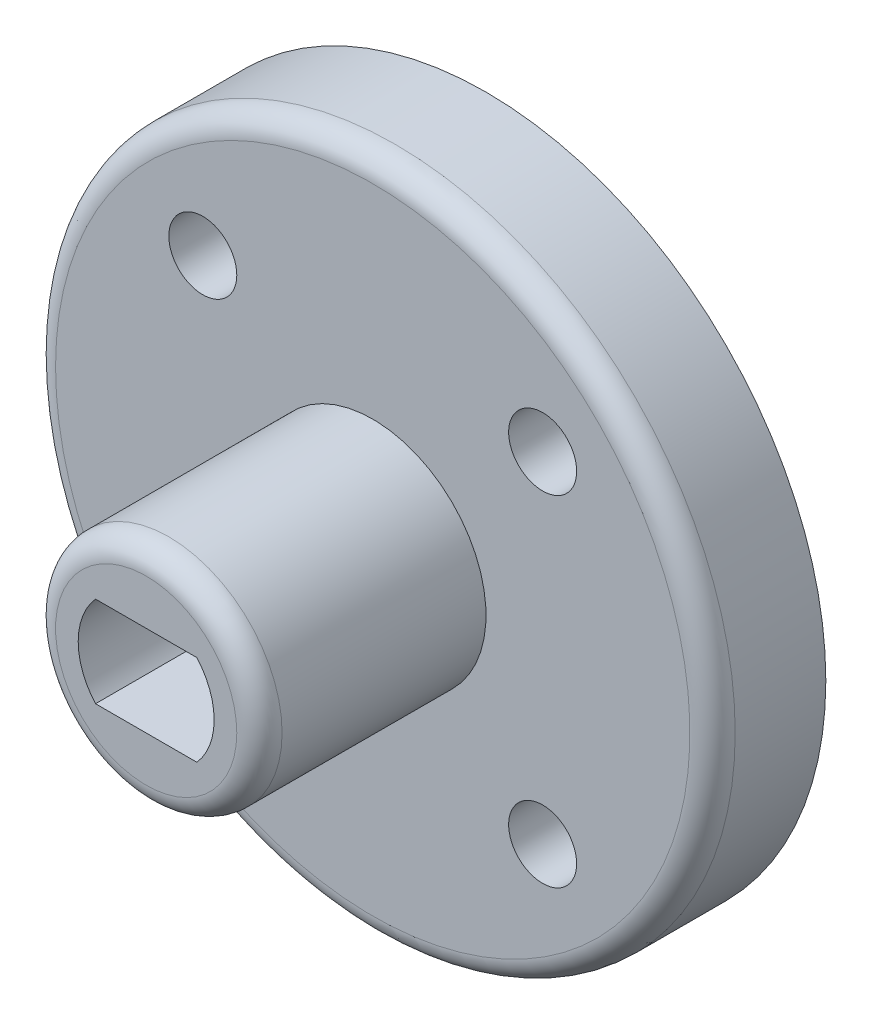
ISO-10303-21;
HEADER;
FILE_DESCRIPTION(('STEP AP214'),'2;1');
FILE_NAME('part.step','',(''),(''),'','','');
FILE_SCHEMA(('AUTOMOTIVE_DESIGN { 1 0 10303 214 1 1 1 1 }'));
ENDSEC;
DATA;
#1=APPLICATION_CONTEXT('core data for automotive mechanical design processes');
#2=APPLICATION_PROTOCOL_DEFINITION('international standard','automotive_design',2000,#1);
#3=PRODUCT_CONTEXT('',#1,'mechanical');
#4=PRODUCT('Part','Part','',(#3));
#5=PRODUCT_RELATED_PRODUCT_CATEGORY('part','',(#4));
#6=PRODUCT_DEFINITION_FORMATION('','',#4);
#7=PRODUCT_DEFINITION_CONTEXT('part definition',#1,'design');
#8=PRODUCT_DEFINITION('design','',#6,#7);
#9=PRODUCT_DEFINITION_SHAPE('','',#8);
#10=(LENGTH_UNIT() NAMED_UNIT(*) SI_UNIT(.MILLI.,.METRE.));
#11=(NAMED_UNIT(*) PLANE_ANGLE_UNIT() SI_UNIT($,.RADIAN.));
#12=(NAMED_UNIT(*) SI_UNIT($,.STERADIAN.) SOLID_ANGLE_UNIT());
#13=UNCERTAINTY_MEASURE_WITH_UNIT(LENGTH_MEASURE(1.E-05),#10,'distance_accuracy_value','');
#14=(GEOMETRIC_REPRESENTATION_CONTEXT(3) GLOBAL_UNCERTAINTY_ASSIGNED_CONTEXT((#13)) GLOBAL_UNIT_ASSIGNED_CONTEXT((#10,
#11,#12)) REPRESENTATION_CONTEXT('',''));
#15=CARTESIAN_POINT('',(0.,0.,0.));
#16=DIRECTION('',(0.,0.,1.));
#17=DIRECTION('',(1.,0.,0.));
#18=AXIS2_PLACEMENT_3D('',#15,#16,#17);
#19=CARTESIAN_POINT('',(0.,0.,5.));
#20=DIRECTION('',(0.,0.,1.));
#21=DIRECTION('',(1.,0.,0.));
#22=AXIS2_PLACEMENT_3D('',#19,#20,#21);
#23=PLANE('',#22);
#24=CARTESIAN_POINT('',(0.,0.,5.));
#25=DIRECTION('',(0.,0.,1.));
#26=DIRECTION('',(1.,0.,0.));
#27=AXIS2_PLACEMENT_3D('',#24,#25,#26);
#28=CIRCLE('',#27,4.);
#29=CARTESIAN_POINT('',(4.,0.,5.));
#30=VERTEX_POINT('',#29);
#31=EDGE_CURVE('E43',#30,#30,#28,.T.);
#32=ORIENTED_EDGE('',*,*,#31,.T.);
#33=EDGE_LOOP('',(#32));
#34=FACE_BOUND('',#33,.T.);
#35=DIRECTION('',(1.,0.,0.));
#36=VECTOR('',#35,1.);
#37=CARTESIAN_POINT('',(-2.23606797749979,-2.,5.));
#38=LINE('',#37,#36);
#39=CARTESIAN_POINT('',(-2.23606797749979,-2.,5.));
#40=VERTEX_POINT('',#39);
#41=CARTESIAN_POINT('',(2.23606797749979,-2.,5.));
#42=VERTEX_POINT('',#41);
#43=EDGE_CURVE('E98',#40,#42,#38,.T.);
#44=ORIENTED_EDGE('',*,*,#43,.F.);
#45=CARTESIAN_POINT('',(0.,0.,5.));
#46=DIRECTION('',(0.,0.,1.));
#47=DIRECTION('',(1.,0.,0.));
#48=AXIS2_PLACEMENT_3D('',#45,#46,#47);
#49=CIRCLE('',#48,3.);
#50=CARTESIAN_POINT('',(-2.23606797749979,2.,5.));
#51=VERTEX_POINT('',#50);
#52=EDGE_CURVE('E76',#51,#40,#49,.T.);
#53=ORIENTED_EDGE('',*,*,#52,.F.);
#54=DIRECTION('',(-1.,0.,0.));
#55=VECTOR('',#54,1.);
#56=CARTESIAN_POINT('',(-2.23606797749979,2.,5.));
#57=LINE('',#56,#55);
#58=CARTESIAN_POINT('',(2.23606797749979,2.,5.));
#59=VERTEX_POINT('',#58);
#60=EDGE_CURVE('E56',#59,#51,#57,.T.);
#61=ORIENTED_EDGE('',*,*,#60,.F.);
#62=CARTESIAN_POINT('',(0.,0.,5.));
#63=DIRECTION('',(0.,0.,1.));
#64=DIRECTION('',(1.,0.,0.));
#65=AXIS2_PLACEMENT_3D('',#62,#63,#64);
#66=CIRCLE('',#65,3.);
#67=EDGE_CURVE('E208',#42,#59,#66,.T.);
#68=ORIENTED_EDGE('',*,*,#67,.F.);
#69=EDGE_LOOP('',(#44,#53,#61,#68));
#70=FACE_BOUND('',#69,.T.);
#71=ADVANCED_FACE('F35',(#34,#70),#23,.T.);
#72=CARTESIAN_POINT('',(0.,0.,5.));
#73=DIRECTION('',(0.,0.,-1.));
#74=DIRECTION('',(-1.,0.,0.));
#75=AXIS2_PLACEMENT_3D('',#72,#73,#74);
#76=CYLINDRICAL_SURFACE('',#75,5.);
#77=CARTESIAN_POINT('',(0.,0.,4.));
#78=DIRECTION('',(0.,0.,1.));
#79=DIRECTION('',(1.,0.,0.));
#80=AXIS2_PLACEMENT_3D('',#77,#78,#79);
#81=CIRCLE('',#80,5.);
#82=CARTESIAN_POINT('',(5.,0.,4.));
#83=VERTEX_POINT('',#82);
#84=EDGE_CURVE('E11',#83,#83,#81,.F.);
#85=ORIENTED_EDGE('',*,*,#84,.T.);
#86=EDGE_LOOP('',(#85));
#87=FACE_BOUND('',#86,.T.);
#88=CARTESIAN_POINT('',(0.,0.,-5.));
#89=DIRECTION('',(0.,0.,-1.));
#90=DIRECTION('',(-1.,0.,0.));
#91=AXIS2_PLACEMENT_3D('',#88,#89,#90);
#92=CIRCLE('',#91,5.);
#93=CARTESIAN_POINT('',(-5.,0.,-5.));
#94=VERTEX_POINT('',#93);
#95=EDGE_CURVE('E93',#94,#94,#92,.T.);
#96=ORIENTED_EDGE('',*,*,#95,.F.);
#97=EDGE_LOOP('',(#96));
#98=FACE_BOUND('',#97,.T.);
#99=ADVANCED_FACE('F127',(#87,#98),#76,.T.);
#100=CARTESIAN_POINT('',(0.,0.,5.));
#101=DIRECTION('',(0.,0.,-1.));
#102=DIRECTION('',(-1.,0.,0.));
#103=AXIS2_PLACEMENT_3D('',#100,#101,#102);
#104=CYLINDRICAL_SURFACE('',#103,3.);
#105=CARTESIAN_POINT('',(0.,0.,-5.));
#106=DIRECTION('',(0.,0.,1.));
#107=DIRECTION('',(1.,0.,0.));
#108=AXIS2_PLACEMENT_3D('',#105,#106,#107);
#109=CIRCLE('',#108,3.);
#110=CARTESIAN_POINT('',(-2.23606797749979,2.,-5.));
#111=VERTEX_POINT('',#110);
#112=CARTESIAN_POINT('',(-2.23606797749979,-2.,-5.));
#113=VERTEX_POINT('',#112);
#114=EDGE_CURVE('E87',#111,#113,#109,.T.);
#115=ORIENTED_EDGE('',*,*,#114,.F.);
#116=DIRECTION('',(0.,0.,-1.));
#117=VECTOR('',#116,1.);
#118=CARTESIAN_POINT('',(-2.23606797749979,2.,5.));
#119=LINE('',#118,#117);
#120=EDGE_CURVE('E79',#51,#111,#119,.T.);
#121=ORIENTED_EDGE('',*,*,#120,.F.);
#122=ORIENTED_EDGE('',*,*,#52,.T.);
#123=DIRECTION('',(0.,0.,-1.));
#124=VECTOR('',#123,1.);
#125=CARTESIAN_POINT('',(-2.23606797749979,-2.,5.));
#126=LINE('',#125,#124);
#127=EDGE_CURVE('E89',#40,#113,#126,.T.);
#128=ORIENTED_EDGE('',*,*,#127,.T.);
#129=EDGE_LOOP('',(#115,#121,#122,#128));
#130=FACE_BOUND('',#129,.T.);
#131=ADVANCED_FACE('F88',(#130),#104,.F.);
#132=CARTESIAN_POINT('',(-2.23606797749979,-2.,5.));
#133=DIRECTION('',(0.,1.,0.));
#134=DIRECTION('',(0.,0.,1.));
#135=AXIS2_PLACEMENT_3D('',#132,#133,#134);
#136=PLANE('',#135);
#137=DIRECTION('',(1.,0.,0.));
#138=VECTOR('',#137,1.);
#139=CARTESIAN_POINT('',(-2.23606797749979,-2.,-5.));
#140=LINE('',#139,#138);
#141=CARTESIAN_POINT('',(2.23606797749979,-2.,-5.));
#142=VERTEX_POINT('',#141);
#143=EDGE_CURVE('E92',#113,#142,#140,.T.);
#144=ORIENTED_EDGE('',*,*,#143,.F.);
#145=ORIENTED_EDGE('',*,*,#127,.F.);
#146=ORIENTED_EDGE('',*,*,#43,.T.);
#147=DIRECTION('',(0.,0.,-1.));
#148=VECTOR('',#147,1.);
#149=CARTESIAN_POINT('',(2.23606797749979,-2.,5.));
#150=LINE('',#149,#148);
#151=EDGE_CURVE('E104',#42,#142,#150,.T.);
#152=ORIENTED_EDGE('',*,*,#151,.T.);
#153=EDGE_LOOP('',(#144,#145,#146,#152));
#154=FACE_BOUND('',#153,.T.);
#155=ADVANCED_FACE('F137',(#154),#136,.T.);
#156=CARTESIAN_POINT('',(0.,0.,5.));
#157=DIRECTION('',(0.,0.,-1.));
#158=DIRECTION('',(-1.,0.,0.));
#159=AXIS2_PLACEMENT_3D('',#156,#157,#158);
#160=CYLINDRICAL_SURFACE('',#159,3.);
#161=CARTESIAN_POINT('',(0.,0.,-5.));
#162=DIRECTION('',(0.,0.,1.));
#163=DIRECTION('',(1.,0.,0.));
#164=AXIS2_PLACEMENT_3D('',#161,#162,#163);
#165=CIRCLE('',#164,3.);
#166=CARTESIAN_POINT('',(2.23606797749979,2.,-5.));
#167=VERTEX_POINT('',#166);
#168=EDGE_CURVE('E96',#142,#167,#165,.T.);
#169=ORIENTED_EDGE('',*,*,#168,.F.);
#170=ORIENTED_EDGE('',*,*,#151,.F.);
#171=ORIENTED_EDGE('',*,*,#67,.T.);
#172=DIRECTION('',(0.,0.,-1.));
#173=VECTOR('',#172,1.);
#174=CARTESIAN_POINT('',(2.23606797749979,2.,5.));
#175=LINE('',#174,#173);
#176=EDGE_CURVE('E50',#59,#167,#175,.T.);
#177=ORIENTED_EDGE('',*,*,#176,.T.);
#178=EDGE_LOOP('',(#169,#170,#171,#177));
#179=FACE_BOUND('',#178,.T.);
#180=ADVANCED_FACE('F140',(#179),#160,.F.);
#181=CARTESIAN_POINT('',(-2.23606797749979,2.,5.));
#182=DIRECTION('',(0.,-1.,0.));
#183=DIRECTION('',(0.,0.,-1.));
#184=AXIS2_PLACEMENT_3D('',#181,#182,#183);
#185=PLANE('',#184);
#186=DIRECTION('',(-1.,0.,0.));
#187=VECTOR('',#186,1.);
#188=CARTESIAN_POINT('',(-2.23606797749979,2.,-5.));
#189=LINE('',#188,#187);
#190=EDGE_CURVE('E83',#167,#111,#189,.T.);
#191=ORIENTED_EDGE('',*,*,#190,.F.);
#192=ORIENTED_EDGE('',*,*,#176,.F.);
#193=ORIENTED_EDGE('',*,*,#60,.T.);
#194=ORIENTED_EDGE('',*,*,#120,.T.);
#195=EDGE_LOOP('',(#191,#192,#193,#194));
#196=FACE_BOUND('',#195,.T.);
#197=ADVANCED_FACE('F81',(#196),#185,.T.);
#198=CARTESIAN_POINT('',(0.,0.,-5.));
#199=DIRECTION('',(0.,0.,-1.));
#200=DIRECTION('',(-1.,0.,0.));
#201=AXIS2_PLACEMENT_3D('',#198,#199,#200);
#202=PLANE('',#201);
#203=ORIENTED_EDGE('',*,*,#114,.T.);
#204=ORIENTED_EDGE('',*,*,#143,.T.);
#205=ORIENTED_EDGE('',*,*,#168,.T.);
#206=ORIENTED_EDGE('',*,*,#190,.T.);
#207=EDGE_LOOP('',(#203,#204,#205,#206));
#208=FACE_BOUND('',#207,.T.);
#209=ADVANCED_FACE('F95',(#208),#202,.F.);
#210=CARTESIAN_POINT('',(0.,0.,-5.));
#211=DIRECTION('',(0.,0.,-1.));
#212=DIRECTION('',(-1.,0.,0.));
#213=AXIS2_PLACEMENT_3D('',#210,#211,#212);
#214=CIRCLE('',#213,14.);
#215=CARTESIAN_POINT('',(-14.,0.,-5.));
#216=VERTEX_POINT('',#215);
#217=EDGE_CURVE('E110',#216,#216,#214,.F.);
#218=ORIENTED_EDGE('',*,*,#217,.T.);
#219=EDGE_LOOP('',(#218));
#220=FACE_BOUND('',#219,.T.);
#221=CARTESIAN_POINT('',(-7.5,7.5,-5.));
#222=DIRECTION('',(0.,0.,1.));
#223=DIRECTION('',(1.,0.,0.));
#224=AXIS2_PLACEMENT_3D('',#221,#222,#223);
#225=CIRCLE('',#224,1.5);
#226=CARTESIAN_POINT('',(-6.,7.5,-5.));
#227=VERTEX_POINT('',#226);
#228=EDGE_CURVE('E179',#227,#227,#225,.T.);
#229=ORIENTED_EDGE('',*,*,#228,.F.);
#230=EDGE_LOOP('',(#229));
#231=FACE_BOUND('',#230,.T.);
#232=CARTESIAN_POINT('',(7.5,7.5,-5.));
#233=DIRECTION('',(0.,0.,1.));
#234=DIRECTION('',(1.,0.,0.));
#235=AXIS2_PLACEMENT_3D('',#232,#233,#234);
#236=CIRCLE('',#235,1.5);
#237=CARTESIAN_POINT('',(9.,7.5,-5.));
#238=VERTEX_POINT('',#237);
#239=EDGE_CURVE('E184',#238,#238,#236,.T.);
#240=ORIENTED_EDGE('',*,*,#239,.F.);
#241=EDGE_LOOP('',(#240));
#242=FACE_BOUND('',#241,.T.);
#243=CARTESIAN_POINT('',(-7.5,-7.5,-5.));
#244=DIRECTION('',(0.,0.,1.));
#245=DIRECTION('',(1.,0.,0.));
#246=AXIS2_PLACEMENT_3D('',#243,#244,#245);
#247=CIRCLE('',#246,1.5);
#248=CARTESIAN_POINT('',(-6.,-7.5,-5.));
#249=VERTEX_POINT('',#248);
#250=EDGE_CURVE('E191',#249,#249,#247,.T.);
#251=ORIENTED_EDGE('',*,*,#250,.F.);
#252=EDGE_LOOP('',(#251));
#253=FACE_BOUND('',#252,.T.);
#254=CARTESIAN_POINT('',(7.5,-7.5,-5.));
#255=DIRECTION('',(0.,0.,1.));
#256=DIRECTION('',(1.,0.,0.));
#257=AXIS2_PLACEMENT_3D('',#254,#255,#256);
#258=CIRCLE('',#257,1.5);
#259=CARTESIAN_POINT('',(9.,-7.5,-5.));
#260=VERTEX_POINT('',#259);
#261=EDGE_CURVE('E194',#260,#260,#258,.T.);
#262=ORIENTED_EDGE('',*,*,#261,.F.);
#263=EDGE_LOOP('',(#262));
#264=FACE_BOUND('',#263,.T.);
#265=ORIENTED_EDGE('',*,*,#95,.T.);
#266=EDGE_LOOP('',(#265));
#267=FACE_BOUND('',#266,.T.);
#268=ADVANCED_FACE('F150',(#220,#231,#242,#253,#264,#267),#202,.F.);
#269=CARTESIAN_POINT('',(0.,0.,-10.));
#270=DIRECTION('',(0.,0.,1.));
#271=DIRECTION('',(1.,0.,0.));
#272=AXIS2_PLACEMENT_3D('',#269,#270,#271);
#273=CYLINDRICAL_SURFACE('',#272,15.);
#274=CARTESIAN_POINT('',(0.,0.,-6.));
#275=DIRECTION('',(0.,0.,-1.));
#276=DIRECTION('',(-1.,0.,0.));
#277=AXIS2_PLACEMENT_3D('',#274,#275,#276);
#278=CIRCLE('',#277,15.);
#279=CARTESIAN_POINT('',(-15.,0.,-6.));
#280=VERTEX_POINT('',#279);
#281=EDGE_CURVE('E107',#280,#280,#278,.T.);
#282=ORIENTED_EDGE('',*,*,#281,.T.);
#283=EDGE_LOOP('',(#282));
#284=FACE_BOUND('',#283,.T.);
#285=CARTESIAN_POINT('',(0.,0.,-10.));
#286=DIRECTION('',(0.,0.,-1.));
#287=DIRECTION('',(-1.,0.,0.));
#288=AXIS2_PLACEMENT_3D('',#285,#286,#287);
#289=CIRCLE('',#288,15.);
#290=CARTESIAN_POINT('',(-15.,0.,-10.));
#291=VERTEX_POINT('',#290);
#292=EDGE_CURVE('E200',#291,#291,#289,.T.);
#293=ORIENTED_EDGE('',*,*,#292,.F.);
#294=EDGE_LOOP('',(#293));
#295=FACE_BOUND('',#294,.T.);
#296=ADVANCED_FACE('F146',(#284,#295),#273,.T.);
#297=CARTESIAN_POINT('',(0.,0.,-10.));
#298=DIRECTION('',(0.,0.,-1.));
#299=DIRECTION('',(-1.,0.,0.));
#300=AXIS2_PLACEMENT_3D('',#297,#298,#299);
#301=PLANE('',#300);
#302=CARTESIAN_POINT('',(-7.5,7.5,-10.));
#303=DIRECTION('',(0.,0.,1.));
#304=DIRECTION('',(1.,0.,0.));
#305=AXIS2_PLACEMENT_3D('',#302,#303,#304);
#306=CIRCLE('',#305,1.5);
#307=CARTESIAN_POINT('',(-6.,7.5,-10.));
#308=VERTEX_POINT('',#307);
#309=EDGE_CURVE('E176',#308,#308,#306,.T.);
#310=ORIENTED_EDGE('',*,*,#309,.T.);
#311=EDGE_LOOP('',(#310));
#312=FACE_BOUND('',#311,.T.);
#313=CARTESIAN_POINT('',(7.5,7.5,-10.));
#314=DIRECTION('',(0.,0.,1.));
#315=DIRECTION('',(1.,0.,0.));
#316=AXIS2_PLACEMENT_3D('',#313,#314,#315);
#317=CIRCLE('',#316,1.5);
#318=CARTESIAN_POINT('',(9.,7.5,-10.));
#319=VERTEX_POINT('',#318);
#320=EDGE_CURVE('E181',#319,#319,#317,.T.);
#321=ORIENTED_EDGE('',*,*,#320,.T.);
#322=EDGE_LOOP('',(#321));
#323=FACE_BOUND('',#322,.T.);
#324=CARTESIAN_POINT('',(-7.5,-7.5,-10.));
#325=DIRECTION('',(0.,0.,1.));
#326=DIRECTION('',(1.,0.,0.));
#327=AXIS2_PLACEMENT_3D('',#324,#325,#326);
#328=CIRCLE('',#327,1.5);
#329=CARTESIAN_POINT('',(-6.,-7.5,-10.));
#330=VERTEX_POINT('',#329);
#331=EDGE_CURVE('E189',#330,#330,#328,.T.);
#332=ORIENTED_EDGE('',*,*,#331,.T.);
#333=EDGE_LOOP('',(#332));
#334=FACE_BOUND('',#333,.T.);
#335=CARTESIAN_POINT('',(7.5,-7.5,-10.));
#336=DIRECTION('',(0.,0.,1.));
#337=DIRECTION('',(1.,0.,0.));
#338=AXIS2_PLACEMENT_3D('',#335,#336,#337);
#339=CIRCLE('',#338,1.5);
#340=CARTESIAN_POINT('',(9.,-7.5,-10.));
#341=VERTEX_POINT('',#340);
#342=EDGE_CURVE('E197',#341,#341,#339,.T.);
#343=ORIENTED_EDGE('',*,*,#342,.T.);
#344=EDGE_LOOP('',(#343));
#345=FACE_BOUND('',#344,.T.);
#346=ORIENTED_EDGE('',*,*,#292,.T.);
#347=EDGE_LOOP('',(#346));
#348=FACE_BOUND('',#347,.T.);
#349=ADVANCED_FACE('F149',(#312,#323,#334,#345,#348),#301,.T.);
#350=CARTESIAN_POINT('',(7.5,-7.5,-10.));
#351=DIRECTION('',(0.,0.,1.));
#352=DIRECTION('',(1.,0.,0.));
#353=AXIS2_PLACEMENT_3D('',#350,#351,#352);
#354=CYLINDRICAL_SURFACE('',#353,1.5);
#355=ORIENTED_EDGE('',*,*,#342,.F.);
#356=EDGE_LOOP('',(#355));
#357=FACE_BOUND('',#356,.T.);
#358=ORIENTED_EDGE('',*,*,#261,.T.);
#359=EDGE_LOOP('',(#358));
#360=FACE_BOUND('',#359,.T.);
#361=ADVANCED_FACE('F156',(#357,#360),#354,.F.);
#362=CARTESIAN_POINT('',(-7.5,-7.5,-10.));
#363=DIRECTION('',(0.,0.,1.));
#364=DIRECTION('',(1.,0.,0.));
#365=AXIS2_PLACEMENT_3D('',#362,#363,#364);
#366=CYLINDRICAL_SURFACE('',#365,1.5);
#367=ORIENTED_EDGE('',*,*,#331,.F.);
#368=EDGE_LOOP('',(#367));
#369=FACE_BOUND('',#368,.T.);
#370=ORIENTED_EDGE('',*,*,#250,.T.);
#371=EDGE_LOOP('',(#370));
#372=FACE_BOUND('',#371,.T.);
#373=ADVANCED_FACE('F160',(#369,#372),#366,.F.);
#374=CARTESIAN_POINT('',(7.5,7.5,-10.));
#375=DIRECTION('',(0.,0.,1.));
#376=DIRECTION('',(1.,0.,0.));
#377=AXIS2_PLACEMENT_3D('',#374,#375,#376);
#378=CYLINDRICAL_SURFACE('',#377,1.5);
#379=ORIENTED_EDGE('',*,*,#320,.F.);
#380=EDGE_LOOP('',(#379));
#381=FACE_BOUND('',#380,.T.);
#382=ORIENTED_EDGE('',*,*,#239,.T.);
#383=EDGE_LOOP('',(#382));
#384=FACE_BOUND('',#383,.T.);
#385=ADVANCED_FACE('F164',(#381,#384),#378,.F.);
#386=CARTESIAN_POINT('',(-7.5,7.5,-10.));
#387=DIRECTION('',(0.,0.,1.));
#388=DIRECTION('',(1.,0.,0.));
#389=AXIS2_PLACEMENT_3D('',#386,#387,#388);
#390=CYLINDRICAL_SURFACE('',#389,1.5);
#391=ORIENTED_EDGE('',*,*,#309,.F.);
#392=EDGE_LOOP('',(#391));
#393=FACE_BOUND('',#392,.T.);
#394=ORIENTED_EDGE('',*,*,#228,.T.);
#395=EDGE_LOOP('',(#394));
#396=FACE_BOUND('',#395,.T.);
#397=ADVANCED_FACE('F123',(#393,#396),#390,.F.);
#398=CARTESIAN_POINT('',(0.,0.,-6.));
#399=DIRECTION('',(0.,0.,-1.));
#400=DIRECTION('',(-1.,0.,0.));
#401=AXIS2_PLACEMENT_3D('',#398,#399,#400);
#402=TOROIDAL_SURFACE('',#401,14.,1.);
#403=ORIENTED_EDGE('',*,*,#217,.F.);
#404=EDGE_LOOP('',(#403));
#405=FACE_BOUND('',#404,.T.);
#406=ORIENTED_EDGE('',*,*,#281,.F.);
#407=EDGE_LOOP('',(#406));
#408=FACE_BOUND('',#407,.T.);
#409=ADVANCED_FACE('F118',(#405,#408),#402,.T.);
#410=CARTESIAN_POINT('',(0.,0.,4.));
#411=DIRECTION('',(0.,0.,1.));
#412=DIRECTION('',(1.,0.,0.));
#413=AXIS2_PLACEMENT_3D('',#410,#411,#412);
#414=TOROIDAL_SURFACE('',#413,4.,1.);
#415=ORIENTED_EDGE('',*,*,#84,.F.);
#416=EDGE_LOOP('',(#415));
#417=FACE_BOUND('',#416,.T.);
#418=ORIENTED_EDGE('',*,*,#31,.F.);
#419=EDGE_LOOP('',(#418));
#420=FACE_BOUND('',#419,.T.);
#421=ADVANCED_FACE('F37',(#417,#420),#414,.T.);
#422=CLOSED_SHELL('',(#71,#99,#131,#155,#180,#197,#209,#268,#296,#349,#361,#373,#385,#397,#409,#421));
#423=MANIFOLD_SOLID_BREP('B2',#422);
#424=ADVANCED_BREP_SHAPE_REPRESENTATION('',(#18,#423),#14);
#425=SHAPE_DEFINITION_REPRESENTATION(#9,#424);
ENDSEC;
END-ISO-10303-21;
